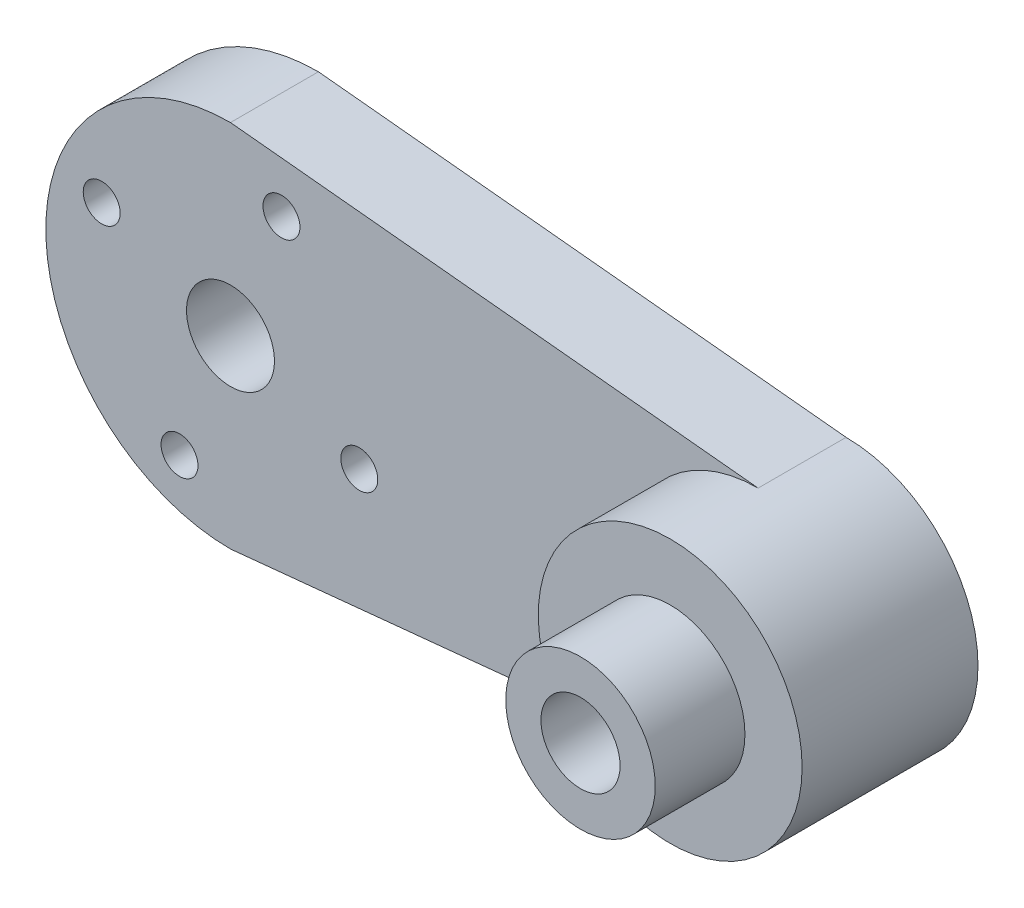
ISO-10303-21;
HEADER;
FILE_DESCRIPTION(('STEP AP214'),'2;1');
FILE_NAME('part.step','',(''),(''),'','','');
FILE_SCHEMA(('AUTOMOTIVE_DESIGN { 1 0 10303 214 1 1 1 1 }'));
ENDSEC;
DATA;
#1=APPLICATION_CONTEXT('core data for automotive mechanical design processes');
#2=APPLICATION_PROTOCOL_DEFINITION('international standard','automotive_design',2000,#1);
#3=PRODUCT_CONTEXT('',#1,'mechanical');
#4=PRODUCT('Part','Part','',(#3));
#5=PRODUCT_RELATED_PRODUCT_CATEGORY('part','',(#4));
#6=PRODUCT_DEFINITION_FORMATION('','',#4);
#7=PRODUCT_DEFINITION_CONTEXT('part definition',#1,'design');
#8=PRODUCT_DEFINITION('design','',#6,#7);
#9=PRODUCT_DEFINITION_SHAPE('','',#8);
#10=(LENGTH_UNIT() NAMED_UNIT(*) SI_UNIT(.MILLI.,.METRE.));
#11=(NAMED_UNIT(*) PLANE_ANGLE_UNIT() SI_UNIT($,.RADIAN.));
#12=(NAMED_UNIT(*) SI_UNIT($,.STERADIAN.) SOLID_ANGLE_UNIT());
#13=UNCERTAINTY_MEASURE_WITH_UNIT(LENGTH_MEASURE(1.E-05),#10,'distance_accuracy_value','');
#14=(GEOMETRIC_REPRESENTATION_CONTEXT(3) GLOBAL_UNCERTAINTY_ASSIGNED_CONTEXT((#13)) GLOBAL_UNIT_ASSIGNED_CONTEXT((#10,
#11,#12)) REPRESENTATION_CONTEXT('',''));
#15=CARTESIAN_POINT('',(0.,0.,0.));
#16=DIRECTION('',(0.,0.,1.));
#17=DIRECTION('',(1.,0.,0.));
#18=AXIS2_PLACEMENT_3D('',#15,#16,#17);
#19=CARTESIAN_POINT('',(0.,0.,0.));
#20=DIRECTION('',(0.,0.,1.));
#21=DIRECTION('',(1.,0.,0.));
#22=AXIS2_PLACEMENT_3D('',#19,#20,#21);
#23=PLANE('',#22);
#24=CARTESIAN_POINT('',(7.3225959378191,-2.89745849088866,0.));
#25=DIRECTION('',(0.,0.,-1.));
#26=DIRECTION('',(-1.,0.,0.));
#27=AXIS2_PLACEMENT_3D('',#24,#25,#26);
#28=CIRCLE('',#27,1.05);
#29=CARTESIAN_POINT('',(6.2725959378191,-2.89745849088866,0.));
#30=VERTEX_POINT('',#29);
#31=EDGE_CURVE('E143',#30,#30,#28,.T.);
#32=ORIENTED_EDGE('',*,*,#31,.F.);
#33=EDGE_LOOP('',(#32));
#34=FACE_BOUND('',#33,.T.);
#35=CARTESIAN_POINT('',(-7.32259593778285,2.89745849098832,0.));
#36=DIRECTION('',(0.,0.,-1.));
#37=DIRECTION('',(-1.,0.,0.));
#38=AXIS2_PLACEMENT_3D('',#35,#36,#37);
#39=CIRCLE('',#38,1.05);
#40=CARTESIAN_POINT('',(-8.37259593778285,2.89745849098832,0.));
#41=VERTEX_POINT('',#40);
#42=EDGE_CURVE('E151',#41,#41,#39,.T.);
#43=ORIENTED_EDGE('',*,*,#42,.F.);
#44=EDGE_LOOP('',(#43));
#45=FACE_BOUND('',#44,.T.);
#46=CARTESIAN_POINT('',(30.,0.,0.));
#47=DIRECTION('',(0.,0.,1.));
#48=DIRECTION('',(1.,0.,0.));
#49=AXIS2_PLACEMENT_3D('',#46,#47,#48);
#50=CIRCLE('',#49,2.25);
#51=CARTESIAN_POINT('',(32.25,0.,0.));
#52=VERTEX_POINT('',#51);
#53=EDGE_CURVE('E103',#52,#52,#50,.T.);
#54=ORIENTED_EDGE('',*,*,#53,.T.);
#55=EDGE_LOOP('',(#54));
#56=FACE_BOUND('',#55,.T.);
#57=CARTESIAN_POINT('',(0.,0.,0.));
#58=DIRECTION('',(0.,0.,1.));
#59=DIRECTION('',(1.,0.,0.));
#60=AXIS2_PLACEMENT_3D('',#57,#58,#59);
#61=CIRCLE('',#60,10.5);
#62=CARTESIAN_POINT('',(0.,10.5,0.));
#63=VERTEX_POINT('',#62);
#64=CARTESIAN_POINT('',(0.,-10.5,0.));
#65=VERTEX_POINT('',#64);
#66=EDGE_CURVE('E109',#63,#65,#61,.T.);
#67=ORIENTED_EDGE('',*,*,#66,.F.);
#68=DIRECTION('',(-0.995037190209989,0.099503719020999,0.));
#69=VECTOR('',#68,1.);
#70=CARTESIAN_POINT('',(0.,10.5,0.));
#71=LINE('',#70,#69);
#72=CARTESIAN_POINT('',(30.,7.5,0.));
#73=VERTEX_POINT('',#72);
#74=EDGE_CURVE('E75',#73,#63,#71,.T.);
#75=ORIENTED_EDGE('',*,*,#74,.F.);
#76=CARTESIAN_POINT('',(30.,0.,0.));
#77=DIRECTION('',(0.,0.,1.));
#78=DIRECTION('',(1.,0.,0.));
#79=AXIS2_PLACEMENT_3D('',#76,#77,#78);
#80=CIRCLE('',#79,7.5);
#81=CARTESIAN_POINT('',(30.,-7.5,0.));
#82=VERTEX_POINT('',#81);
#83=EDGE_CURVE('E70',#82,#73,#80,.T.);
#84=ORIENTED_EDGE('',*,*,#83,.F.);
#85=DIRECTION('',(0.995037190209989,0.099503719020999,0.));
#86=VECTOR('',#85,1.);
#87=CARTESIAN_POINT('',(30.,-7.5,0.));
#88=LINE('',#87,#86);
#89=EDGE_CURVE('E117',#65,#82,#88,.T.);
#90=ORIENTED_EDGE('',*,*,#89,.F.);
#91=EDGE_LOOP('',(#67,#75,#84,#90));
#92=FACE_BOUND('',#91,.T.);
#93=CARTESIAN_POINT('',(0.,0.,0.));
#94=DIRECTION('',(0.,0.,1.));
#95=DIRECTION('',(1.,0.,0.));
#96=AXIS2_PLACEMENT_3D('',#93,#94,#95);
#97=CIRCLE('',#96,2.5);
#98=CARTESIAN_POINT('',(2.5,0.,0.));
#99=VERTEX_POINT('',#98);
#100=EDGE_CURVE('E100',#99,#99,#97,.T.);
#101=ORIENTED_EDGE('',*,*,#100,.T.);
#102=EDGE_LOOP('',(#101));
#103=FACE_BOUND('',#102,.T.);
#104=CARTESIAN_POINT('',(2.89745849095653,7.32259593785083,0.));
#105=DIRECTION('',(0.,0.,-1.));
#106=DIRECTION('',(-1.,0.,0.));
#107=AXIS2_PLACEMENT_3D('',#104,#105,#106);
#108=CIRCLE('',#107,1.05);
#109=CARTESIAN_POINT('',(1.84745849095653,7.32259593785083,0.));
#110=VERTEX_POINT('',#109);
#111=EDGE_CURVE('E135',#110,#110,#108,.T.);
#112=ORIENTED_EDGE('',*,*,#111,.F.);
#113=EDGE_LOOP('',(#112));
#114=FACE_BOUND('',#113,.T.);
#115=CARTESIAN_POINT('',(-2.89745849092033,-7.32259593775116,0.));
#116=DIRECTION('',(0.,0.,-1.));
#117=DIRECTION('',(-1.,0.,0.));
#118=AXIS2_PLACEMENT_3D('',#115,#116,#117);
#119=CIRCLE('',#118,1.05);
#120=CARTESIAN_POINT('',(-3.94745849092033,-7.32259593775116,0.));
#121=VERTEX_POINT('',#120);
#122=EDGE_CURVE('E138',#121,#121,#119,.T.);
#123=ORIENTED_EDGE('',*,*,#122,.F.);
#124=EDGE_LOOP('',(#123));
#125=FACE_BOUND('',#124,.T.);
#126=ADVANCED_FACE('F33',(#34,#45,#56,#92,#103,#114,#125),#23,.F.);
#127=CARTESIAN_POINT('',(0.,0.,5.));
#128=DIRECTION('',(0.,0.,1.));
#129=DIRECTION('',(1.,0.,0.));
#130=AXIS2_PLACEMENT_3D('',#127,#128,#129);
#131=PLANE('',#130);
#132=CARTESIAN_POINT('',(-2.89745849092033,-7.32259593775116,5.));
#133=DIRECTION('',(0.,0.,1.));
#134=DIRECTION('',(1.,0.,0.));
#135=AXIS2_PLACEMENT_3D('',#132,#133,#134);
#136=CIRCLE('',#135,1.05);
#137=CARTESIAN_POINT('',(-1.84745849092034,-7.32259593775116,5.));
#138=VERTEX_POINT('',#137);
#139=EDGE_CURVE('E140',#138,#138,#136,.T.);
#140=ORIENTED_EDGE('',*,*,#139,.F.);
#141=EDGE_LOOP('',(#140));
#142=FACE_BOUND('',#141,.T.);
#143=CARTESIAN_POINT('',(7.3225959378191,-2.89745849088866,5.));
#144=DIRECTION('',(0.,0.,1.));
#145=DIRECTION('',(1.,0.,0.));
#146=AXIS2_PLACEMENT_3D('',#143,#144,#145);
#147=CIRCLE('',#146,1.05);
#148=CARTESIAN_POINT('',(8.3725959378191,-2.89745849088866,5.));
#149=VERTEX_POINT('',#148);
#150=EDGE_CURVE('E148',#149,#149,#147,.T.);
#151=ORIENTED_EDGE('',*,*,#150,.F.);
#152=EDGE_LOOP('',(#151));
#153=FACE_BOUND('',#152,.T.);
#154=CARTESIAN_POINT('',(-7.32259593778285,2.89745849098832,5.));
#155=DIRECTION('',(0.,0.,1.));
#156=DIRECTION('',(1.,0.,0.));
#157=AXIS2_PLACEMENT_3D('',#154,#155,#156);
#158=CIRCLE('',#157,1.05);
#159=CARTESIAN_POINT('',(-6.27259593778286,2.89745849098832,5.));
#160=VERTEX_POINT('',#159);
#161=EDGE_CURVE('E154',#160,#160,#158,.T.);
#162=ORIENTED_EDGE('',*,*,#161,.F.);
#163=EDGE_LOOP('',(#162));
#164=FACE_BOUND('',#163,.T.);
#165=CARTESIAN_POINT('',(2.89745849095653,7.32259593785083,5.));
#166=DIRECTION('',(0.,0.,1.));
#167=DIRECTION('',(1.,0.,0.));
#168=AXIS2_PLACEMENT_3D('',#165,#166,#167);
#169=CIRCLE('',#168,1.05);
#170=CARTESIAN_POINT('',(3.94745849095653,7.32259593785083,5.));
#171=VERTEX_POINT('',#170);
#172=EDGE_CURVE('E158',#171,#171,#169,.T.);
#173=ORIENTED_EDGE('',*,*,#172,.F.);
#174=EDGE_LOOP('',(#173));
#175=FACE_BOUND('',#174,.T.);
#176=CARTESIAN_POINT('',(30.,0.,5.));
#177=DIRECTION('',(0.,0.,1.));
#178=DIRECTION('',(1.,0.,0.));
#179=AXIS2_PLACEMENT_3D('',#176,#177,#178);
#180=CIRCLE('',#179,7.5);
#181=CARTESIAN_POINT('',(30.,7.5,5.));
#182=VERTEX_POINT('',#181);
#183=CARTESIAN_POINT('',(30.,-7.5,5.));
#184=VERTEX_POINT('',#183);
#185=EDGE_CURVE('E91',#182,#184,#180,.T.);
#186=ORIENTED_EDGE('',*,*,#185,.F.);
#187=DIRECTION('',(-0.995037190209989,0.099503719020999,0.));
#188=VECTOR('',#187,1.);
#189=CARTESIAN_POINT('',(0.,10.5,5.));
#190=LINE('',#189,#188);
#191=CARTESIAN_POINT('',(0.,10.5,5.));
#192=VERTEX_POINT('',#191);
#193=EDGE_CURVE('E51',#182,#192,#190,.T.);
#194=ORIENTED_EDGE('',*,*,#193,.T.);
#195=CARTESIAN_POINT('',(0.,0.,5.));
#196=DIRECTION('',(0.,0.,1.));
#197=DIRECTION('',(1.,0.,0.));
#198=AXIS2_PLACEMENT_3D('',#195,#196,#197);
#199=CIRCLE('',#198,10.5);
#200=CARTESIAN_POINT('',(0.,-10.5,5.));
#201=VERTEX_POINT('',#200);
#202=EDGE_CURVE('E112',#192,#201,#199,.T.);
#203=ORIENTED_EDGE('',*,*,#202,.T.);
#204=DIRECTION('',(0.995037190209989,0.099503719020999,0.));
#205=VECTOR('',#204,1.);
#206=CARTESIAN_POINT('',(30.,-7.5,5.));
#207=LINE('',#206,#205);
#208=EDGE_CURVE('E81',#201,#184,#207,.T.);
#209=ORIENTED_EDGE('',*,*,#208,.T.);
#210=EDGE_LOOP('',(#186,#194,#203,#209));
#211=FACE_BOUND('',#210,.T.);
#212=CARTESIAN_POINT('',(0.,0.,5.));
#213=DIRECTION('',(0.,0.,1.));
#214=DIRECTION('',(1.,0.,0.));
#215=AXIS2_PLACEMENT_3D('',#212,#213,#214);
#216=CIRCLE('',#215,2.5);
#217=CARTESIAN_POINT('',(2.5,0.,5.));
#218=VERTEX_POINT('',#217);
#219=EDGE_CURVE('E106',#218,#218,#216,.T.);
#220=ORIENTED_EDGE('',*,*,#219,.F.);
#221=EDGE_LOOP('',(#220));
#222=FACE_BOUND('',#221,.T.);
#223=ADVANCED_FACE('F94',(#142,#153,#164,#175,#211,#222),#131,.T.);
#224=CARTESIAN_POINT('',(0.,0.,5.));
#225=DIRECTION('',(0.,0.,-1.));
#226=DIRECTION('',(-1.,0.,0.));
#227=AXIS2_PLACEMENT_3D('',#224,#225,#226);
#228=CYLINDRICAL_SURFACE('',#227,10.5);
#229=ORIENTED_EDGE('',*,*,#66,.T.);
#230=DIRECTION('',(0.,0.,-1.));
#231=VECTOR('',#230,1.);
#232=CARTESIAN_POINT('',(0.,-10.5,5.));
#233=LINE('',#232,#231);
#234=EDGE_CURVE('E37',#201,#65,#233,.T.);
#235=ORIENTED_EDGE('',*,*,#234,.F.);
#236=ORIENTED_EDGE('',*,*,#202,.F.);
#237=DIRECTION('',(0.,0.,-1.));
#238=VECTOR('',#237,1.);
#239=CARTESIAN_POINT('',(0.,10.5,5.));
#240=LINE('',#239,#238);
#241=EDGE_CURVE('E85',#192,#63,#240,.T.);
#242=ORIENTED_EDGE('',*,*,#241,.T.);
#243=EDGE_LOOP('',(#229,#235,#236,#242));
#244=FACE_BOUND('',#243,.T.);
#245=ADVANCED_FACE('F35',(#244),#228,.T.);
#246=CARTESIAN_POINT('',(30.,-7.5,5.));
#247=DIRECTION('',(-0.099503719020999,0.995037190209989,0.));
#248=DIRECTION('',(-0.995037190209989,-0.099503719020999,0.));
#249=AXIS2_PLACEMENT_3D('',#246,#247,#248);
#250=PLANE('',#249);
#251=ORIENTED_EDGE('',*,*,#89,.T.);
#252=DIRECTION('',(0.,0.,-1.));
#253=VECTOR('',#252,1.);
#254=CARTESIAN_POINT('',(30.,-7.5,5.));
#255=LINE('',#254,#253);
#256=EDGE_CURVE('E92',#184,#82,#255,.T.);
#257=ORIENTED_EDGE('',*,*,#256,.F.);
#258=ORIENTED_EDGE('',*,*,#208,.F.);
#259=ORIENTED_EDGE('',*,*,#234,.T.);
#260=EDGE_LOOP('',(#251,#257,#258,#259));
#261=FACE_BOUND('',#260,.T.);
#262=ADVANCED_FACE('F122',(#261),#250,.F.);
#263=CARTESIAN_POINT('',(30.,0.,5.));
#264=DIRECTION('',(0.,0.,-1.));
#265=DIRECTION('',(-1.,0.,0.));
#266=AXIS2_PLACEMENT_3D('',#263,#264,#265);
#267=CYLINDRICAL_SURFACE('',#266,7.5);
#268=ORIENTED_EDGE('',*,*,#83,.T.);
#269=DIRECTION('',(0.,0.,-1.));
#270=VECTOR('',#269,1.);
#271=CARTESIAN_POINT('',(30.,7.5,5.));
#272=LINE('',#271,#270);
#273=EDGE_CURVE('E84',#182,#73,#272,.T.);
#274=ORIENTED_EDGE('',*,*,#273,.F.);
#275=ORIENTED_EDGE('',*,*,#185,.T.);
#276=ORIENTED_EDGE('',*,*,#256,.T.);
#277=EDGE_LOOP('',(#268,#274,#275,#276));
#278=FACE_BOUND('',#277,.T.);
#279=CARTESIAN_POINT('',(30.,0.,10.));
#280=DIRECTION('',(0.,0.,1.));
#281=DIRECTION('',(1.,0.,0.));
#282=AXIS2_PLACEMENT_3D('',#279,#280,#281);
#283=CIRCLE('',#282,7.5);
#284=CARTESIAN_POINT('',(37.5,0.,10.));
#285=VERTEX_POINT('',#284);
#286=EDGE_CURVE('E96',#285,#285,#283,.T.);
#287=ORIENTED_EDGE('',*,*,#286,.F.);
#288=EDGE_LOOP('',(#287));
#289=FACE_BOUND('',#288,.T.);
#290=ADVANCED_FACE('F89',(#278,#289),#267,.T.);
#291=CARTESIAN_POINT('',(0.,10.5,5.));
#292=DIRECTION('',(-0.099503719020999,-0.995037190209989,0.));
#293=DIRECTION('',(0.995037190209989,-0.099503719020999,0.));
#294=AXIS2_PLACEMENT_3D('',#291,#292,#293);
#295=PLANE('',#294);
#296=ORIENTED_EDGE('',*,*,#74,.T.);
#297=ORIENTED_EDGE('',*,*,#241,.F.);
#298=ORIENTED_EDGE('',*,*,#193,.F.);
#299=ORIENTED_EDGE('',*,*,#273,.T.);
#300=EDGE_LOOP('',(#296,#297,#298,#299));
#301=FACE_BOUND('',#300,.T.);
#302=ADVANCED_FACE('F83',(#301),#295,.F.);
#303=CARTESIAN_POINT('',(0.,0.,5.));
#304=DIRECTION('',(0.,0.,-1.));
#305=DIRECTION('',(-1.,0.,0.));
#306=AXIS2_PLACEMENT_3D('',#303,#304,#305);
#307=CYLINDRICAL_SURFACE('',#306,2.5);
#308=ORIENTED_EDGE('',*,*,#219,.T.);
#309=EDGE_LOOP('',(#308));
#310=FACE_BOUND('',#309,.T.);
#311=ORIENTED_EDGE('',*,*,#100,.F.);
#312=EDGE_LOOP('',(#311));
#313=FACE_BOUND('',#312,.T.);
#314=ADVANCED_FACE('F192',(#310,#313),#307,.F.);
#315=CARTESIAN_POINT('',(30.,0.,10.));
#316=DIRECTION('',(0.,0.,1.));
#317=DIRECTION('',(1.,0.,0.));
#318=AXIS2_PLACEMENT_3D('',#315,#316,#317);
#319=PLANE('',#318);
#320=CARTESIAN_POINT('',(30.,0.,10.));
#321=DIRECTION('',(0.,0.,1.));
#322=DIRECTION('',(1.,0.,0.));
#323=AXIS2_PLACEMENT_3D('',#320,#321,#322);
#324=CIRCLE('',#323,4.25000000000001);
#325=CARTESIAN_POINT('',(34.25,0.,10.));
#326=VERTEX_POINT('',#325);
#327=EDGE_CURVE('E11',#326,#326,#324,.T.);
#328=ORIENTED_EDGE('',*,*,#327,.F.);
#329=EDGE_LOOP('',(#328));
#330=FACE_BOUND('',#329,.T.);
#331=ORIENTED_EDGE('',*,*,#286,.T.);
#332=EDGE_LOOP('',(#331));
#333=FACE_BOUND('',#332,.T.);
#334=ADVANCED_FACE('F188',(#330,#333),#319,.T.);
#335=CARTESIAN_POINT('',(30.,0.,15.1));
#336=DIRECTION('',(0.,0.,-1.));
#337=DIRECTION('',(-1.,0.,0.));
#338=AXIS2_PLACEMENT_3D('',#335,#336,#337);
#339=CYLINDRICAL_SURFACE('',#338,4.25000000000001);
#340=CARTESIAN_POINT('',(30.,0.,15.1));
#341=DIRECTION('',(0.,0.,1.));
#342=DIRECTION('',(1.,0.,0.));
#343=AXIS2_PLACEMENT_3D('',#340,#341,#342);
#344=CIRCLE('',#343,4.25000000000001);
#345=CARTESIAN_POINT('',(34.25,0.,15.1));
#346=VERTEX_POINT('',#345);
#347=EDGE_CURVE('E97',#346,#346,#344,.T.);
#348=ORIENTED_EDGE('',*,*,#347,.F.);
#349=EDGE_LOOP('',(#348));
#350=FACE_BOUND('',#349,.T.);
#351=ORIENTED_EDGE('',*,*,#327,.T.);
#352=EDGE_LOOP('',(#351));
#353=FACE_BOUND('',#352,.T.);
#354=ADVANCED_FACE('F181',(#350,#353),#339,.T.);
#355=CARTESIAN_POINT('',(30.,0.,15.1));
#356=DIRECTION('',(0.,0.,1.));
#357=DIRECTION('',(1.,0.,0.));
#358=AXIS2_PLACEMENT_3D('',#355,#356,#357);
#359=PLANE('',#358);
#360=CARTESIAN_POINT('',(30.,0.,15.1));
#361=DIRECTION('',(0.,0.,1.));
#362=DIRECTION('',(1.,0.,0.));
#363=AXIS2_PLACEMENT_3D('',#360,#361,#362);
#364=CIRCLE('',#363,2.25);
#365=CARTESIAN_POINT('',(32.25,0.,15.1));
#366=VERTEX_POINT('',#365);
#367=EDGE_CURVE('E161',#366,#366,#364,.T.);
#368=ORIENTED_EDGE('',*,*,#367,.F.);
#369=EDGE_LOOP('',(#368));
#370=FACE_BOUND('',#369,.T.);
#371=ORIENTED_EDGE('',*,*,#347,.T.);
#372=EDGE_LOOP('',(#371));
#373=FACE_BOUND('',#372,.T.);
#374=ADVANCED_FACE('F171',(#370,#373),#359,.T.);
#375=CARTESIAN_POINT('',(30.,0.,-21.));
#376=DIRECTION('',(0.,0.,1.));
#377=DIRECTION('',(1.,0.,0.));
#378=AXIS2_PLACEMENT_3D('',#375,#376,#377);
#379=CYLINDRICAL_SURFACE('',#378,2.25);
#380=ORIENTED_EDGE('',*,*,#367,.T.);
#381=EDGE_LOOP('',(#380));
#382=FACE_BOUND('',#381,.T.);
#383=ORIENTED_EDGE('',*,*,#53,.F.);
#384=EDGE_LOOP('',(#383));
#385=FACE_BOUND('',#384,.T.);
#386=ADVANCED_FACE('F168',(#382,#385),#379,.F.);
#387=CARTESIAN_POINT('',(2.89745849095653,7.32259593785083,0.));
#388=DIRECTION('',(0.,0.,-1.));
#389=DIRECTION('',(-1.,0.,0.));
#390=AXIS2_PLACEMENT_3D('',#387,#388,#389);
#391=CYLINDRICAL_SURFACE('',#390,1.05);
#392=ORIENTED_EDGE('',*,*,#111,.T.);
#393=EDGE_LOOP('',(#392));
#394=FACE_BOUND('',#393,.T.);
#395=ORIENTED_EDGE('',*,*,#172,.T.);
#396=EDGE_LOOP('',(#395));
#397=FACE_BOUND('',#396,.T.);
#398=ADVANCED_FACE('F170',(#394,#397),#391,.F.);
#399=CARTESIAN_POINT('',(-7.32259593778285,2.89745849098832,0.));
#400=DIRECTION('',(0.,0.,-1.));
#401=DIRECTION('',(-1.,0.,0.));
#402=AXIS2_PLACEMENT_3D('',#399,#400,#401);
#403=CYLINDRICAL_SURFACE('',#402,1.05);
#404=ORIENTED_EDGE('',*,*,#42,.T.);
#405=EDGE_LOOP('',(#404));
#406=FACE_BOUND('',#405,.T.);
#407=ORIENTED_EDGE('',*,*,#161,.T.);
#408=EDGE_LOOP('',(#407));
#409=FACE_BOUND('',#408,.T.);
#410=ADVANCED_FACE('F178',(#406,#409),#403,.F.);
#411=CARTESIAN_POINT('',(7.3225959378191,-2.89745849088866,0.));
#412=DIRECTION('',(0.,0.,-1.));
#413=DIRECTION('',(-1.,0.,0.));
#414=AXIS2_PLACEMENT_3D('',#411,#412,#413);
#415=CYLINDRICAL_SURFACE('',#414,1.05);
#416=ORIENTED_EDGE('',*,*,#31,.T.);
#417=EDGE_LOOP('',(#416));
#418=FACE_BOUND('',#417,.T.);
#419=ORIENTED_EDGE('',*,*,#150,.T.);
#420=EDGE_LOOP('',(#419));
#421=FACE_BOUND('',#420,.T.);
#422=ADVANCED_FACE('F283',(#418,#421),#415,.F.);
#423=CARTESIAN_POINT('',(-2.89745849092033,-7.32259593775116,0.));
#424=DIRECTION('',(0.,0.,-1.));
#425=DIRECTION('',(-1.,0.,0.));
#426=AXIS2_PLACEMENT_3D('',#423,#424,#425);
#427=CYLINDRICAL_SURFACE('',#426,1.05);
#428=ORIENTED_EDGE('',*,*,#122,.T.);
#429=EDGE_LOOP('',(#428));
#430=FACE_BOUND('',#429,.T.);
#431=ORIENTED_EDGE('',*,*,#139,.T.);
#432=EDGE_LOOP('',(#431));
#433=FACE_BOUND('',#432,.T.);
#434=ADVANCED_FACE('F291',(#430,#433),#427,.F.);
#435=CLOSED_SHELL('',(#126,#223,#245,#262,#290,#302,#314,#334,#354,#374,#386,#398,#410,#422,#434));
#436=MANIFOLD_SOLID_BREP('B2',#435);
#437=ADVANCED_BREP_SHAPE_REPRESENTATION('',(#18,#436),#14);
#438=SHAPE_DEFINITION_REPRESENTATION(#9,#437);
ENDSEC;
END-ISO-10303-21;
